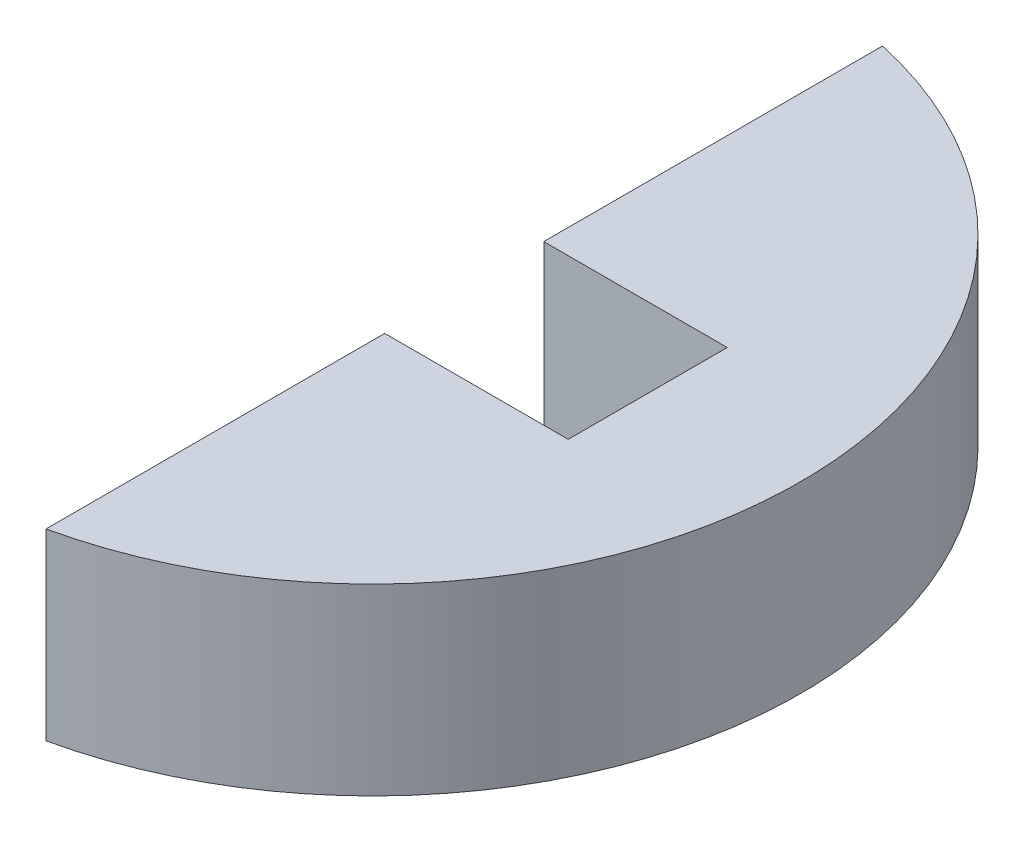
ISO-10303-21;
HEADER;
FILE_DESCRIPTION(('STEP AP214'),'2;1');
FILE_NAME('part.step','',(''),(''),'','','');
FILE_SCHEMA(('AUTOMOTIVE_DESIGN { 1 0 10303 214 1 1 1 1 }'));
ENDSEC;
DATA;
#1=APPLICATION_CONTEXT('core data for automotive mechanical design processes');
#2=APPLICATION_PROTOCOL_DEFINITION('international standard','automotive_design',2000,#1);
#3=PRODUCT_CONTEXT('',#1,'mechanical');
#4=PRODUCT('Part','Part','',(#3));
#5=PRODUCT_RELATED_PRODUCT_CATEGORY('part','',(#4));
#6=PRODUCT_DEFINITION_FORMATION('','',#4);
#7=PRODUCT_DEFINITION_CONTEXT('part definition',#1,'design');
#8=PRODUCT_DEFINITION('design','',#6,#7);
#9=PRODUCT_DEFINITION_SHAPE('','',#8);
#10=(LENGTH_UNIT() NAMED_UNIT(*) SI_UNIT(.MILLI.,.METRE.));
#11=(NAMED_UNIT(*) PLANE_ANGLE_UNIT() SI_UNIT($,.RADIAN.));
#12=(NAMED_UNIT(*) SI_UNIT($,.STERADIAN.) SOLID_ANGLE_UNIT());
#13=UNCERTAINTY_MEASURE_WITH_UNIT(LENGTH_MEASURE(1.E-05),#10,'distance_accuracy_value','');
#14=(GEOMETRIC_REPRESENTATION_CONTEXT(3) GLOBAL_UNCERTAINTY_ASSIGNED_CONTEXT((#13)) GLOBAL_UNIT_ASSIGNED_CONTEXT((#10,
#11,#12)) REPRESENTATION_CONTEXT('',''));
#15=CARTESIAN_POINT('',(0.,0.,0.));
#16=DIRECTION('',(0.,0.,1.));
#17=DIRECTION('',(1.,0.,0.));
#18=AXIS2_PLACEMENT_3D('',#15,#16,#17);
#19=CARTESIAN_POINT('',(0.,-1.5,0.));
#20=DIRECTION('',(0.,1.,0.));
#21=DIRECTION('',(0.,0.,1.));
#22=AXIS2_PLACEMENT_3D('',#19,#20,#21);
#23=CYLINDRICAL_SURFACE('',#22,7.);
#24=DIRECTION('',(0.,1.,0.));
#25=VECTOR('',#24,1.);
#26=CARTESIAN_POINT('',(1.5,-1.5,-6.83739716558867));
#27=LINE('',#26,#25);
#28=CARTESIAN_POINT('',(1.5,-1.5,-6.83739716558867));
#29=VERTEX_POINT('',#28);
#30=CARTESIAN_POINT('',(1.5,1.5,-6.83739716558867));
#31=VERTEX_POINT('',#30);
#32=EDGE_CURVE('E36',#29,#31,#27,.T.);
#33=ORIENTED_EDGE('',*,*,#32,.T.);
#34=CARTESIAN_POINT('',(0.,1.5,0.));
#35=DIRECTION('',(0.,1.,0.));
#36=DIRECTION('',(0.,0.,1.));
#37=AXIS2_PLACEMENT_3D('',#34,#35,#36);
#38=CIRCLE('',#37,7.);
#39=CARTESIAN_POINT('',(1.5,1.5,6.83739716558867));
#40=VERTEX_POINT('',#39);
#41=EDGE_CURVE('E85',#40,#31,#38,.T.);
#42=ORIENTED_EDGE('',*,*,#41,.F.);
#43=DIRECTION('',(0.,1.,0.));
#44=VECTOR('',#43,1.);
#45=CARTESIAN_POINT('',(1.5,-1.5,6.83739716558867));
#46=LINE('',#45,#44);
#47=CARTESIAN_POINT('',(1.5,-1.5,6.83739716558867));
#48=VERTEX_POINT('',#47);
#49=EDGE_CURVE('E11',#48,#40,#46,.T.);
#50=ORIENTED_EDGE('',*,*,#49,.F.);
#51=CARTESIAN_POINT('',(0.,-1.5,0.));
#52=DIRECTION('',(0.,1.,0.));
#53=DIRECTION('',(0.,0.,1.));
#54=AXIS2_PLACEMENT_3D('',#51,#52,#53);
#55=CIRCLE('',#54,7.);
#56=EDGE_CURVE('E86',#48,#29,#55,.T.);
#57=ORIENTED_EDGE('',*,*,#56,.T.);
#58=EDGE_LOOP('',(#33,#42,#50,#57));
#59=FACE_BOUND('',#58,.T.);
#60=ADVANCED_FACE('F33',(#59),#23,.T.);
#61=CARTESIAN_POINT('',(1.5,-1.5,6.83739716558867));
#62=DIRECTION('',(-1.,0.,0.));
#63=DIRECTION('',(0.,0.,1.));
#64=AXIS2_PLACEMENT_3D('',#61,#62,#63);
#65=PLANE('',#64);
#66=ORIENTED_EDGE('',*,*,#49,.T.);
#67=DIRECTION('',(0.,0.,1.));
#68=VECTOR('',#67,1.);
#69=CARTESIAN_POINT('',(1.5,1.5,6.83739716558867));
#70=LINE('',#69,#68);
#71=CARTESIAN_POINT('',(1.5,1.5,1.3));
#72=VERTEX_POINT('',#71);
#73=EDGE_CURVE('E103',#72,#40,#70,.T.);
#74=ORIENTED_EDGE('',*,*,#73,.F.);
#75=DIRECTION('',(0.,1.,0.));
#76=VECTOR('',#75,1.);
#77=CARTESIAN_POINT('',(1.5,-1.5,1.3));
#78=LINE('',#77,#76);
#79=CARTESIAN_POINT('',(1.5,-1.5,1.3));
#80=VERTEX_POINT('',#79);
#81=EDGE_CURVE('E41',#80,#72,#78,.T.);
#82=ORIENTED_EDGE('',*,*,#81,.F.);
#83=DIRECTION('',(0.,0.,1.));
#84=VECTOR('',#83,1.);
#85=CARTESIAN_POINT('',(1.5,-1.5,6.83739716558867));
#86=LINE('',#85,#84);
#87=EDGE_CURVE('E91',#80,#48,#86,.T.);
#88=ORIENTED_EDGE('',*,*,#87,.T.);
#89=EDGE_LOOP('',(#66,#74,#82,#88));
#90=FACE_BOUND('',#89,.T.);
#91=ADVANCED_FACE('F143',(#90),#65,.T.);
#92=CARTESIAN_POINT('',(1.5,-1.5,1.3));
#93=DIRECTION('',(0.,0.,-1.));
#94=DIRECTION('',(-1.,0.,0.));
#95=AXIS2_PLACEMENT_3D('',#92,#93,#94);
#96=PLANE('',#95);
#97=ORIENTED_EDGE('',*,*,#81,.T.);
#98=DIRECTION('',(-1.,0.,0.));
#99=VECTOR('',#98,1.);
#100=CARTESIAN_POINT('',(1.5,1.5,1.3));
#101=LINE('',#100,#99);
#102=CARTESIAN_POINT('',(4.5,1.5,1.3));
#103=VERTEX_POINT('',#102);
#104=EDGE_CURVE('E110',#103,#72,#101,.T.);
#105=ORIENTED_EDGE('',*,*,#104,.F.);
#106=DIRECTION('',(0.,1.,0.));
#107=VECTOR('',#106,1.);
#108=CARTESIAN_POINT('',(4.5,-1.5,1.3));
#109=LINE('',#108,#107);
#110=CARTESIAN_POINT('',(4.5,-1.5,1.3));
#111=VERTEX_POINT('',#110);
#112=EDGE_CURVE('E126',#111,#103,#109,.T.);
#113=ORIENTED_EDGE('',*,*,#112,.F.);
#114=DIRECTION('',(-1.,0.,0.));
#115=VECTOR('',#114,1.);
#116=CARTESIAN_POINT('',(1.5,-1.5,1.3));
#117=LINE('',#116,#115);
#118=EDGE_CURVE('E122',#111,#80,#117,.T.);
#119=ORIENTED_EDGE('',*,*,#118,.T.);
#120=EDGE_LOOP('',(#97,#105,#113,#119));
#121=FACE_BOUND('',#120,.T.);
#122=ADVANCED_FACE('F139',(#121),#96,.T.);
#123=CARTESIAN_POINT('',(4.5,-1.5,1.3));
#124=DIRECTION('',(-1.,0.,0.));
#125=DIRECTION('',(0.,0.,1.));
#126=AXIS2_PLACEMENT_3D('',#123,#124,#125);
#127=PLANE('',#126);
#128=ORIENTED_EDGE('',*,*,#112,.T.);
#129=DIRECTION('',(0.,0.,1.));
#130=VECTOR('',#129,1.);
#131=CARTESIAN_POINT('',(4.5,1.5,1.3));
#132=LINE('',#131,#130);
#133=CARTESIAN_POINT('',(4.5,1.5,-1.3));
#134=VERTEX_POINT('',#133);
#135=EDGE_CURVE('E107',#134,#103,#132,.T.);
#136=ORIENTED_EDGE('',*,*,#135,.F.);
#137=DIRECTION('',(0.,1.,0.));
#138=VECTOR('',#137,1.);
#139=CARTESIAN_POINT('',(4.5,-1.5,-1.3));
#140=LINE('',#139,#138);
#141=CARTESIAN_POINT('',(4.5,-1.5,-1.3));
#142=VERTEX_POINT('',#141);
#143=EDGE_CURVE('E128',#142,#134,#140,.T.);
#144=ORIENTED_EDGE('',*,*,#143,.F.);
#145=DIRECTION('',(0.,0.,1.));
#146=VECTOR('',#145,1.);
#147=CARTESIAN_POINT('',(4.5,-1.5,1.3));
#148=LINE('',#147,#146);
#149=EDGE_CURVE('E119',#142,#111,#148,.T.);
#150=ORIENTED_EDGE('',*,*,#149,.T.);
#151=EDGE_LOOP('',(#128,#136,#144,#150));
#152=FACE_BOUND('',#151,.T.);
#153=ADVANCED_FACE('F136',(#152),#127,.T.);
#154=CARTESIAN_POINT('',(4.5,-1.5,-1.3));
#155=DIRECTION('',(0.,0.,1.));
#156=DIRECTION('',(1.,0.,0.));
#157=AXIS2_PLACEMENT_3D('',#154,#155,#156);
#158=PLANE('',#157);
#159=ORIENTED_EDGE('',*,*,#143,.T.);
#160=DIRECTION('',(1.,0.,0.));
#161=VECTOR('',#160,1.);
#162=CARTESIAN_POINT('',(4.5,1.5,-1.3));
#163=LINE('',#162,#161);
#164=CARTESIAN_POINT('',(1.5,1.5,-1.3));
#165=VERTEX_POINT('',#164);
#166=EDGE_CURVE('E98',#165,#134,#163,.T.);
#167=ORIENTED_EDGE('',*,*,#166,.F.);
#168=DIRECTION('',(0.,1.,0.));
#169=VECTOR('',#168,1.);
#170=CARTESIAN_POINT('',(1.5,-1.5,-1.3));
#171=LINE('',#170,#169);
#172=CARTESIAN_POINT('',(1.5,-1.5,-1.3));
#173=VERTEX_POINT('',#172);
#174=EDGE_CURVE('E90',#173,#165,#171,.T.);
#175=ORIENTED_EDGE('',*,*,#174,.F.);
#176=DIRECTION('',(1.,0.,0.));
#177=VECTOR('',#176,1.);
#178=CARTESIAN_POINT('',(4.5,-1.5,-1.3));
#179=LINE('',#178,#177);
#180=EDGE_CURVE('E116',#173,#142,#179,.T.);
#181=ORIENTED_EDGE('',*,*,#180,.T.);
#182=EDGE_LOOP('',(#159,#167,#175,#181));
#183=FACE_BOUND('',#182,.T.);
#184=ADVANCED_FACE('F130',(#183),#158,.T.);
#185=CARTESIAN_POINT('',(1.5,-1.5,-1.3));
#186=DIRECTION('',(-1.,0.,0.));
#187=DIRECTION('',(0.,0.,1.));
#188=AXIS2_PLACEMENT_3D('',#185,#186,#187);
#189=PLANE('',#188);
#190=ORIENTED_EDGE('',*,*,#174,.T.);
#191=DIRECTION('',(0.,0.,1.));
#192=VECTOR('',#191,1.);
#193=CARTESIAN_POINT('',(1.5,1.5,-1.3));
#194=LINE('',#193,#192);
#195=EDGE_CURVE('E93',#31,#165,#194,.T.);
#196=ORIENTED_EDGE('',*,*,#195,.F.);
#197=ORIENTED_EDGE('',*,*,#32,.F.);
#198=DIRECTION('',(0.,0.,1.));
#199=VECTOR('',#198,1.);
#200=CARTESIAN_POINT('',(1.5,-1.5,-1.3));
#201=LINE('',#200,#199);
#202=EDGE_CURVE('E114',#29,#173,#201,.T.);
#203=ORIENTED_EDGE('',*,*,#202,.T.);
#204=EDGE_LOOP('',(#190,#196,#197,#203));
#205=FACE_BOUND('',#204,.T.);
#206=ADVANCED_FACE('F94',(#205),#189,.T.);
#207=CARTESIAN_POINT('',(0.,-1.5,0.));
#208=DIRECTION('',(0.,1.,0.));
#209=DIRECTION('',(0.,0.,1.));
#210=AXIS2_PLACEMENT_3D('',#207,#208,#209);
#211=PLANE('',#210);
#212=ORIENTED_EDGE('',*,*,#56,.F.);
#213=ORIENTED_EDGE('',*,*,#87,.F.);
#214=ORIENTED_EDGE('',*,*,#118,.F.);
#215=ORIENTED_EDGE('',*,*,#149,.F.);
#216=ORIENTED_EDGE('',*,*,#180,.F.);
#217=ORIENTED_EDGE('',*,*,#202,.F.);
#218=EDGE_LOOP('',(#212,#213,#214,#215,#216,#217));
#219=FACE_BOUND('',#218,.T.);
#220=ADVANCED_FACE('F142',(#219),#211,.F.);
#221=CARTESIAN_POINT('',(0.,1.5,0.));
#222=DIRECTION('',(0.,1.,0.));
#223=DIRECTION('',(0.,0.,1.));
#224=AXIS2_PLACEMENT_3D('',#221,#222,#223);
#225=PLANE('',#224);
#226=ORIENTED_EDGE('',*,*,#41,.T.);
#227=ORIENTED_EDGE('',*,*,#195,.T.);
#228=ORIENTED_EDGE('',*,*,#166,.T.);
#229=ORIENTED_EDGE('',*,*,#135,.T.);
#230=ORIENTED_EDGE('',*,*,#104,.T.);
#231=ORIENTED_EDGE('',*,*,#73,.T.);
#232=EDGE_LOOP('',(#226,#227,#228,#229,#230,#231));
#233=FACE_BOUND('',#232,.T.);
#234=ADVANCED_FACE('F101',(#233),#225,.T.);
#235=CLOSED_SHELL('',(#60,#91,#122,#153,#184,#206,#220,#234));
#236=MANIFOLD_SOLID_BREP('B2',#235);
#237=ADVANCED_BREP_SHAPE_REPRESENTATION('',(#18,#236),#14);
#238=SHAPE_DEFINITION_REPRESENTATION(#9,#237);
ENDSEC;
END-ISO-10303-21;
